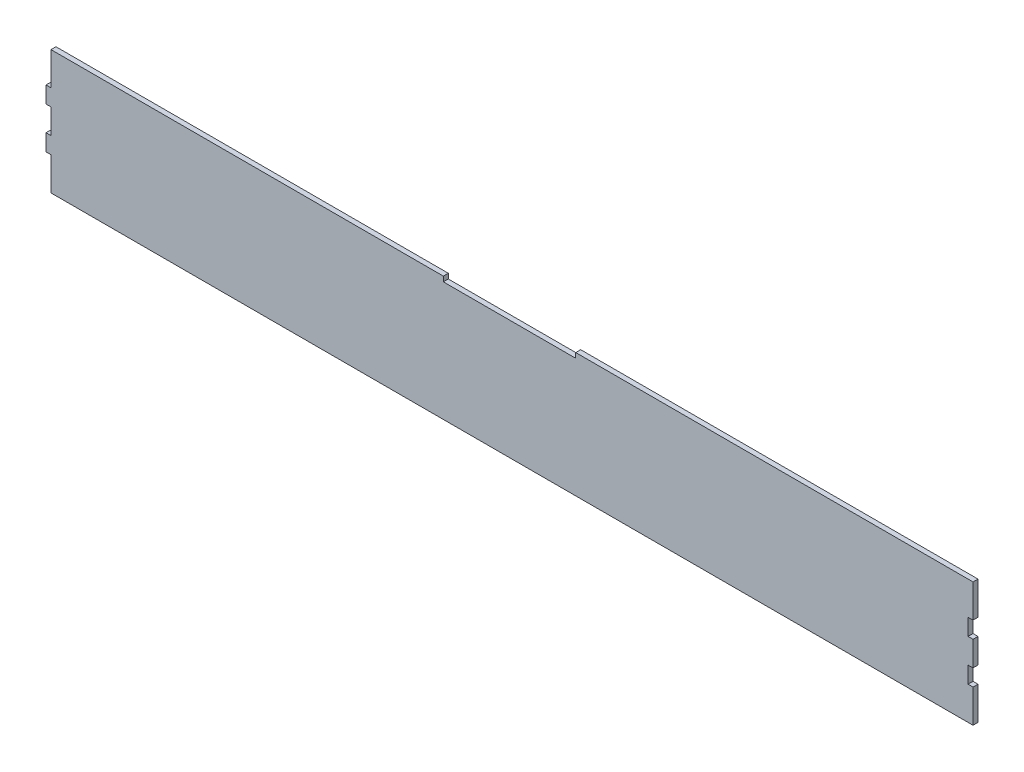
ISO-10303-21;
HEADER;
FILE_DESCRIPTION(('STEP AP214'),'2;1');
FILE_NAME('part.step','',(''),(''),'','','');
FILE_SCHEMA(('AUTOMOTIVE_DESIGN { 1 0 10303 214 1 1 1 1 }'));
ENDSEC;
DATA;
#1=APPLICATION_CONTEXT('core data for automotive mechanical design processes');
#2=APPLICATION_PROTOCOL_DEFINITION('international standard','automotive_design',2000,#1);
#3=PRODUCT_CONTEXT('',#1,'mechanical');
#4=PRODUCT('Part','Part','',(#3));
#5=PRODUCT_RELATED_PRODUCT_CATEGORY('part','',(#4));
#6=PRODUCT_DEFINITION_FORMATION('','',#4);
#7=PRODUCT_DEFINITION_CONTEXT('part definition',#1,'design');
#8=PRODUCT_DEFINITION('design','',#6,#7);
#9=PRODUCT_DEFINITION_SHAPE('','',#8);
#10=(LENGTH_UNIT() NAMED_UNIT(*) SI_UNIT(.MILLI.,.METRE.));
#11=(NAMED_UNIT(*) PLANE_ANGLE_UNIT() SI_UNIT($,.RADIAN.));
#12=(NAMED_UNIT(*) SI_UNIT($,.STERADIAN.) SOLID_ANGLE_UNIT());
#13=UNCERTAINTY_MEASURE_WITH_UNIT(LENGTH_MEASURE(1.E-05),#10,'distance_accuracy_value','');
#14=(GEOMETRIC_REPRESENTATION_CONTEXT(3) GLOBAL_UNCERTAINTY_ASSIGNED_CONTEXT((#13)) GLOBAL_UNIT_ASSIGNED_CONTEXT((#10,
#11,#12)) REPRESENTATION_CONTEXT('',''));
#15=CARTESIAN_POINT('',(0.,0.,0.));
#16=DIRECTION('',(0.,0.,1.));
#17=DIRECTION('',(1.,0.,0.));
#18=AXIS2_PLACEMENT_3D('',#15,#16,#17);
#19=CARTESIAN_POINT('',(-232.344937666755,214.488975695473,3.));
#20=DIRECTION('',(0.,1.,0.));
#21=DIRECTION('',(0.,0.,1.));
#22=AXIS2_PLACEMENT_3D('',#19,#20,#21);
#23=PLANE('',#22);
#24=DIRECTION('',(1.,0.,0.));
#25=VECTOR('',#24,1.);
#26=CARTESIAN_POINT('',(-232.344937666755,214.488975695473,0.));
#27=LINE('',#26,#25);
#28=CARTESIAN_POINT('',(87.6550623332451,214.488975695473,0.));
#29=VERTEX_POINT('',#28);
#30=CARTESIAN_POINT('',(327.655062333245,214.488975695473,0.));
#31=VERTEX_POINT('',#30);
#32=EDGE_CURVE('E407',#29,#31,#27,.T.);
#33=ORIENTED_EDGE('',*,*,#32,.F.);
#34=DIRECTION('',(0.,0.,1.));
#35=VECTOR('',#34,1.);
#36=CARTESIAN_POINT('',(87.6550623332451,214.488975695473,0.));
#37=LINE('',#36,#35);
#38=CARTESIAN_POINT('',(87.6550623332452,214.488975695473,3.));
#39=VERTEX_POINT('',#38);
#40=EDGE_CURVE('E202',#29,#39,#37,.T.);
#41=ORIENTED_EDGE('',*,*,#40,.T.);
#42=DIRECTION('',(1.,0.,0.));
#43=VECTOR('',#42,1.);
#44=CARTESIAN_POINT('',(-232.344937666755,214.488975695473,3.));
#45=LINE('',#44,#43);
#46=CARTESIAN_POINT('',(327.655062333245,214.488975695473,3.));
#47=VERTEX_POINT('',#46);
#48=EDGE_CURVE('E374',#39,#47,#45,.T.);
#49=ORIENTED_EDGE('',*,*,#48,.T.);
#50=DIRECTION('',(0.,0.,-1.));
#51=VECTOR('',#50,1.);
#52=CARTESIAN_POINT('',(327.655062333245,214.488975695473,3.));
#53=LINE('',#52,#51);
#54=EDGE_CURVE('E46',#47,#31,#53,.T.);
#55=ORIENTED_EDGE('',*,*,#54,.T.);
#56=EDGE_LOOP('',(#33,#41,#49,#55));
#57=FACE_BOUND('',#56,.T.);
#58=ADVANCED_FACE('F38',(#57),#23,.T.);
#59=CARTESIAN_POINT('',(0.,0.,3.));
#60=DIRECTION('',(0.,0.,-1.));
#61=DIRECTION('',(-1.,0.,0.));
#62=AXIS2_PLACEMENT_3D('',#59,#60,#61);
#63=PLANE('',#62);
#64=DIRECTION('',(1.,0.,0.));
#65=VECTOR('',#64,1.);
#66=CARTESIAN_POINT('',(7.65506233324513,211.488975695473,3.));
#67=LINE('',#66,#65);
#68=CARTESIAN_POINT('',(7.65506233324513,211.488975695473,3.));
#69=VERTEX_POINT('',#68);
#70=CARTESIAN_POINT('',(87.6550623332451,211.488975695473,3.));
#71=VERTEX_POINT('',#70);
#72=EDGE_CURVE('E214',#69,#71,#67,.T.);
#73=ORIENTED_EDGE('',*,*,#72,.F.);
#74=DIRECTION('',(0.,-1.,0.));
#75=VECTOR('',#74,1.);
#76=CARTESIAN_POINT('',(7.65506233324513,214.488975695473,3.));
#77=LINE('',#76,#75);
#78=CARTESIAN_POINT('',(7.65506233324513,214.488975695473,3.));
#79=VERTEX_POINT('',#78);
#80=EDGE_CURVE('E218',#79,#69,#77,.T.);
#81=ORIENTED_EDGE('',*,*,#80,.F.);
#82=CARTESIAN_POINT('',(-229.344937666755,214.488975695473,3.));
#83=VERTEX_POINT('',#82);
#84=EDGE_CURVE('E268',#83,#79,#45,.T.);
#85=ORIENTED_EDGE('',*,*,#84,.F.);
#86=DIRECTION('',(0.,-1.,0.));
#87=VECTOR('',#86,1.);
#88=CARTESIAN_POINT('',(-229.344937666755,214.488975695473,3.));
#89=LINE('',#88,#87);
#90=CARTESIAN_POINT('',(-229.344937666755,194.488975695473,3.));
#91=VERTEX_POINT('',#90);
#92=EDGE_CURVE('E245',#83,#91,#89,.T.);
#93=ORIENTED_EDGE('',*,*,#92,.T.);
#94=DIRECTION('',(1.,0.,0.));
#95=VECTOR('',#94,1.);
#96=CARTESIAN_POINT('',(-232.344937666755,194.488975695473,3.));
#97=LINE('',#96,#95);
#98=CARTESIAN_POINT('',(-232.344937666755,194.488975695473,3.));
#99=VERTEX_POINT('',#98);
#100=EDGE_CURVE('E248',#99,#91,#97,.T.);
#101=ORIENTED_EDGE('',*,*,#100,.F.);
#102=DIRECTION('',(0.,-1.,0.));
#103=VECTOR('',#102,1.);
#104=CARTESIAN_POINT('',(-232.344937666755,214.488975695473,3.));
#105=LINE('',#104,#103);
#106=CARTESIAN_POINT('',(-232.344937666755,184.488975695473,3.));
#107=VERTEX_POINT('',#106);
#108=EDGE_CURVE('E267',#99,#107,#105,.T.);
#109=ORIENTED_EDGE('',*,*,#108,.T.);
#110=DIRECTION('',(1.,0.,0.));
#111=VECTOR('',#110,1.);
#112=CARTESIAN_POINT('',(-232.344937666755,184.488975695473,3.));
#113=LINE('',#112,#111);
#114=CARTESIAN_POINT('',(-229.344937666755,184.488975695473,3.));
#115=VERTEX_POINT('',#114);
#116=EDGE_CURVE('E253',#107,#115,#113,.T.);
#117=ORIENTED_EDGE('',*,*,#116,.T.);
#118=DIRECTION('',(0.,1.,0.));
#119=VECTOR('',#118,1.);
#120=CARTESIAN_POINT('',(-229.344937666755,169.488975695473,3.));
#121=LINE('',#120,#119);
#122=CARTESIAN_POINT('',(-229.344937666755,169.488975695473,3.));
#123=VERTEX_POINT('',#122);
#124=EDGE_CURVE('E447',#123,#115,#121,.T.);
#125=ORIENTED_EDGE('',*,*,#124,.F.);
#126=DIRECTION('',(1.,0.,0.));
#127=VECTOR('',#126,1.);
#128=CARTESIAN_POINT('',(-232.344937666755,169.488975695473,3.));
#129=LINE('',#128,#127);
#130=CARTESIAN_POINT('',(-232.344937666755,169.488975695473,3.));
#131=VERTEX_POINT('',#130);
#132=EDGE_CURVE('E442',#131,#123,#129,.T.);
#133=ORIENTED_EDGE('',*,*,#132,.F.);
#134=CARTESIAN_POINT('',(-232.344937666755,159.488975695473,3.));
#135=VERTEX_POINT('',#134);
#136=EDGE_CURVE('E262',#131,#135,#105,.T.);
#137=ORIENTED_EDGE('',*,*,#136,.T.);
#138=DIRECTION('',(1.,0.,0.));
#139=VECTOR('',#138,1.);
#140=CARTESIAN_POINT('',(-232.344937666755,159.488975695473,3.));
#141=LINE('',#140,#139);
#142=CARTESIAN_POINT('',(-229.344937666755,159.488975695473,3.));
#143=VERTEX_POINT('',#142);
#144=EDGE_CURVE('E61',#135,#143,#141,.T.);
#145=ORIENTED_EDGE('',*,*,#144,.T.);
#146=DIRECTION('',(0.,1.,0.));
#147=VECTOR('',#146,1.);
#148=CARTESIAN_POINT('',(-229.344937666755,139.488975695473,3.));
#149=LINE('',#148,#147);
#150=CARTESIAN_POINT('',(-229.344937666755,139.488975695473,3.));
#151=VERTEX_POINT('',#150);
#152=EDGE_CURVE('E286',#151,#143,#149,.T.);
#153=ORIENTED_EDGE('',*,*,#152,.F.);
#154=DIRECTION('',(1.,0.,0.));
#155=VECTOR('',#154,1.);
#156=CARTESIAN_POINT('',(-232.344937666755,139.488975695473,3.));
#157=LINE('',#156,#155);
#158=CARTESIAN_POINT('',(327.655062333245,139.488975695473,3.));
#159=VERTEX_POINT('',#158);
#160=EDGE_CURVE('E365',#151,#159,#157,.T.);
#161=ORIENTED_EDGE('',*,*,#160,.T.);
#162=DIRECTION('',(0.,-1.,0.));
#163=VECTOR('',#162,1.);
#164=CARTESIAN_POINT('',(327.655062333245,214.488975695473,3.));
#165=LINE('',#164,#163);
#166=CARTESIAN_POINT('',(327.655062333245,159.488975695473,3.));
#167=VERTEX_POINT('',#166);
#168=EDGE_CURVE('E368',#167,#159,#165,.T.);
#169=ORIENTED_EDGE('',*,*,#168,.F.);
#170=DIRECTION('',(-1.,0.,0.));
#171=VECTOR('',#170,1.);
#172=CARTESIAN_POINT('',(327.655062333245,159.488975695473,3.));
#173=LINE('',#172,#171);
#174=CARTESIAN_POINT('',(324.655062333245,159.488975695473,3.));
#175=VERTEX_POINT('',#174);
#176=EDGE_CURVE('E343',#167,#175,#173,.T.);
#177=ORIENTED_EDGE('',*,*,#176,.T.);
#178=DIRECTION('',(0.,1.,0.));
#179=VECTOR('',#178,1.);
#180=CARTESIAN_POINT('',(324.655062333245,159.488975695473,3.));
#181=LINE('',#180,#179);
#182=CARTESIAN_POINT('',(324.655062333245,169.488975695473,3.));
#183=VERTEX_POINT('',#182);
#184=EDGE_CURVE('E348',#175,#183,#181,.T.);
#185=ORIENTED_EDGE('',*,*,#184,.T.);
#186=DIRECTION('',(-1.,0.,0.));
#187=VECTOR('',#186,1.);
#188=CARTESIAN_POINT('',(327.655062333245,169.488975695473,3.));
#189=LINE('',#188,#187);
#190=CARTESIAN_POINT('',(327.655062333245,169.488975695473,3.));
#191=VERTEX_POINT('',#190);
#192=EDGE_CURVE('E311',#191,#183,#189,.T.);
#193=ORIENTED_EDGE('',*,*,#192,.F.);
#194=CARTESIAN_POINT('',(327.655062333245,184.488975695473,3.));
#195=VERTEX_POINT('',#194);
#196=EDGE_CURVE('E375',#195,#191,#165,.T.);
#197=ORIENTED_EDGE('',*,*,#196,.F.);
#198=DIRECTION('',(-1.,0.,0.));
#199=VECTOR('',#198,1.);
#200=CARTESIAN_POINT('',(327.655062333245,184.488975695473,3.));
#201=LINE('',#200,#199);
#202=CARTESIAN_POINT('',(324.655062333245,184.488975695473,3.));
#203=VERTEX_POINT('',#202);
#204=EDGE_CURVE('E305',#195,#203,#201,.T.);
#205=ORIENTED_EDGE('',*,*,#204,.T.);
#206=DIRECTION('',(0.,-1.,0.));
#207=VECTOR('',#206,1.);
#208=CARTESIAN_POINT('',(324.655062333245,194.488975695473,3.));
#209=LINE('',#208,#207);
#210=CARTESIAN_POINT('',(324.655062333245,194.488975695473,3.));
#211=VERTEX_POINT('',#210);
#212=EDGE_CURVE('E310',#211,#203,#209,.T.);
#213=ORIENTED_EDGE('',*,*,#212,.F.);
#214=DIRECTION('',(-1.,0.,0.));
#215=VECTOR('',#214,1.);
#216=CARTESIAN_POINT('',(327.655062333245,194.488975695473,3.));
#217=LINE('',#216,#215);
#218=CARTESIAN_POINT('',(327.655062333245,194.488975695473,3.));
#219=VERTEX_POINT('',#218);
#220=EDGE_CURVE('E298',#219,#211,#217,.T.);
#221=ORIENTED_EDGE('',*,*,#220,.F.);
#222=EDGE_CURVE('E370',#47,#219,#165,.T.);
#223=ORIENTED_EDGE('',*,*,#222,.F.);
#224=ORIENTED_EDGE('',*,*,#48,.F.);
#225=DIRECTION('',(0.,-1.,0.));
#226=VECTOR('',#225,1.);
#227=CARTESIAN_POINT('',(87.6550623332451,214.488975695473,3.));
#228=LINE('',#227,#226);
#229=EDGE_CURVE('E53',#39,#71,#228,.T.);
#230=ORIENTED_EDGE('',*,*,#229,.T.);
#231=EDGE_LOOP('',(#73,#81,#85,#93,#101,#109,#117,#125,#133,#137,#145,#153,#161,#169,#177,#185,
#193,#197,#205,#213,#221,#223,#224,#230));
#232=FACE_BOUND('',#231,.T.);
#233=ADVANCED_FACE('F421',(#232),#63,.F.);
#234=CARTESIAN_POINT('',(0.,0.,0.));
#235=DIRECTION('',(0.,0.,-1.));
#236=DIRECTION('',(-1.,0.,0.));
#237=AXIS2_PLACEMENT_3D('',#234,#235,#236);
#238=PLANE('',#237);
#239=DIRECTION('',(0.,-1.,0.));
#240=VECTOR('',#239,1.);
#241=CARTESIAN_POINT('',(7.65506233324513,214.488975695473,0.));
#242=LINE('',#241,#240);
#243=CARTESIAN_POINT('',(7.65506233324513,214.488975695473,0.));
#244=VERTEX_POINT('',#243);
#245=CARTESIAN_POINT('',(7.65506233324513,211.488975695473,0.));
#246=VERTEX_POINT('',#245);
#247=EDGE_CURVE('E206',#244,#246,#242,.T.);
#248=ORIENTED_EDGE('',*,*,#247,.T.);
#249=DIRECTION('',(1.,0.,0.));
#250=VECTOR('',#249,1.);
#251=CARTESIAN_POINT('',(7.65506233324513,211.488975695473,0.));
#252=LINE('',#251,#250);
#253=CARTESIAN_POINT('',(87.6550623332451,211.488975695473,0.));
#254=VERTEX_POINT('',#253);
#255=EDGE_CURVE('E207',#246,#254,#252,.T.);
#256=ORIENTED_EDGE('',*,*,#255,.T.);
#257=DIRECTION('',(0.,-1.,0.));
#258=VECTOR('',#257,1.);
#259=CARTESIAN_POINT('',(87.6550623332451,214.488975695473,0.));
#260=LINE('',#259,#258);
#261=EDGE_CURVE('E197',#29,#254,#260,.T.);
#262=ORIENTED_EDGE('',*,*,#261,.F.);
#263=ORIENTED_EDGE('',*,*,#32,.T.);
#264=DIRECTION('',(0.,-1.,0.));
#265=VECTOR('',#264,1.);
#266=CARTESIAN_POINT('',(327.655062333245,214.488975695473,0.));
#267=LINE('',#266,#265);
#268=CARTESIAN_POINT('',(327.655062333245,194.488975695473,0.));
#269=VERTEX_POINT('',#268);
#270=EDGE_CURVE('E403',#31,#269,#267,.T.);
#271=ORIENTED_EDGE('',*,*,#270,.T.);
#272=DIRECTION('',(-1.,0.,0.));
#273=VECTOR('',#272,1.);
#274=CARTESIAN_POINT('',(327.655062333245,194.488975695473,0.));
#275=LINE('',#274,#273);
#276=CARTESIAN_POINT('',(324.655062333245,194.488975695473,0.));
#277=VERTEX_POINT('',#276);
#278=EDGE_CURVE('E301',#269,#277,#275,.T.);
#279=ORIENTED_EDGE('',*,*,#278,.T.);
#280=DIRECTION('',(0.,-1.,0.));
#281=VECTOR('',#280,1.);
#282=CARTESIAN_POINT('',(324.655062333245,194.488975695473,0.));
#283=LINE('',#282,#281);
#284=CARTESIAN_POINT('',(324.655062333245,184.488975695473,0.));
#285=VERTEX_POINT('',#284);
#286=EDGE_CURVE('E297',#277,#285,#283,.T.);
#287=ORIENTED_EDGE('',*,*,#286,.T.);
#288=DIRECTION('',(-1.,0.,0.));
#289=VECTOR('',#288,1.);
#290=CARTESIAN_POINT('',(327.655062333245,184.488975695473,0.));
#291=LINE('',#290,#289);
#292=CARTESIAN_POINT('',(327.655062333245,184.488975695473,0.));
#293=VERTEX_POINT('',#292);
#294=EDGE_CURVE('E295',#293,#285,#291,.T.);
#295=ORIENTED_EDGE('',*,*,#294,.F.);
#296=CARTESIAN_POINT('',(327.655062333245,169.488975695473,0.));
#297=VERTEX_POINT('',#296);
#298=EDGE_CURVE('E402',#293,#297,#267,.T.);
#299=ORIENTED_EDGE('',*,*,#298,.T.);
#300=DIRECTION('',(-1.,0.,0.));
#301=VECTOR('',#300,1.);
#302=CARTESIAN_POINT('',(327.655062333245,169.488975695473,0.));
#303=LINE('',#302,#301);
#304=CARTESIAN_POINT('',(324.655062333245,169.488975695473,0.));
#305=VERTEX_POINT('',#304);
#306=EDGE_CURVE('E349',#297,#305,#303,.T.);
#307=ORIENTED_EDGE('',*,*,#306,.T.);
#308=DIRECTION('',(0.,1.,0.));
#309=VECTOR('',#308,1.);
#310=CARTESIAN_POINT('',(324.655062333245,159.488975695473,0.));
#311=LINE('',#310,#309);
#312=CARTESIAN_POINT('',(324.655062333245,159.488975695473,0.));
#313=VERTEX_POINT('',#312);
#314=EDGE_CURVE('E361',#313,#305,#311,.T.);
#315=ORIENTED_EDGE('',*,*,#314,.F.);
#316=DIRECTION('',(-1.,0.,0.));
#317=VECTOR('',#316,1.);
#318=CARTESIAN_POINT('',(327.655062333245,159.488975695473,0.));
#319=LINE('',#318,#317);
#320=CARTESIAN_POINT('',(327.655062333245,159.488975695473,0.));
#321=VERTEX_POINT('',#320);
#322=EDGE_CURVE('E334',#321,#313,#319,.T.);
#323=ORIENTED_EDGE('',*,*,#322,.F.);
#324=CARTESIAN_POINT('',(327.655062333245,139.488975695473,0.));
#325=VERTEX_POINT('',#324);
#326=EDGE_CURVE('E399',#321,#325,#267,.T.);
#327=ORIENTED_EDGE('',*,*,#326,.T.);
#328=DIRECTION('',(1.,0.,0.));
#329=VECTOR('',#328,1.);
#330=CARTESIAN_POINT('',(-232.344937666755,139.488975695473,0.));
#331=LINE('',#330,#329);
#332=CARTESIAN_POINT('',(-229.344937666755,139.488975695473,0.));
#333=VERTEX_POINT('',#332);
#334=EDGE_CURVE('E271',#333,#325,#331,.T.);
#335=ORIENTED_EDGE('',*,*,#334,.F.);
#336=DIRECTION('',(0.,1.,0.));
#337=VECTOR('',#336,1.);
#338=CARTESIAN_POINT('',(-229.344937666755,139.488975695473,0.));
#339=LINE('',#338,#337);
#340=CARTESIAN_POINT('',(-229.344937666755,159.488975695473,0.));
#341=VERTEX_POINT('',#340);
#342=EDGE_CURVE('E289',#333,#341,#339,.T.);
#343=ORIENTED_EDGE('',*,*,#342,.T.);
#344=DIRECTION('',(1.,0.,0.));
#345=VECTOR('',#344,1.);
#346=CARTESIAN_POINT('',(-232.344937666755,159.488975695473,0.));
#347=LINE('',#346,#345);
#348=CARTESIAN_POINT('',(-232.344937666755,159.488975695473,0.));
#349=VERTEX_POINT('',#348);
#350=EDGE_CURVE('E292',#349,#341,#347,.T.);
#351=ORIENTED_EDGE('',*,*,#350,.F.);
#352=DIRECTION('',(0.,-1.,0.));
#353=VECTOR('',#352,1.);
#354=CARTESIAN_POINT('',(-232.344937666755,214.488975695473,0.));
#355=LINE('',#354,#353);
#356=CARTESIAN_POINT('',(-232.344937666755,169.488975695473,0.));
#357=VERTEX_POINT('',#356);
#358=EDGE_CURVE('E411',#357,#349,#355,.T.);
#359=ORIENTED_EDGE('',*,*,#358,.F.);
#360=DIRECTION('',(1.,0.,0.));
#361=VECTOR('',#360,1.);
#362=CARTESIAN_POINT('',(-232.344937666755,169.488975695473,0.));
#363=LINE('',#362,#361);
#364=CARTESIAN_POINT('',(-229.344937666755,169.488975695473,0.));
#365=VERTEX_POINT('',#364);
#366=EDGE_CURVE('E433',#357,#365,#363,.T.);
#367=ORIENTED_EDGE('',*,*,#366,.T.);
#368=DIRECTION('',(0.,1.,0.));
#369=VECTOR('',#368,1.);
#370=CARTESIAN_POINT('',(-229.344937666755,169.488975695473,0.));
#371=LINE('',#370,#369);
#372=CARTESIAN_POINT('',(-229.344937666755,184.488975695473,0.));
#373=VERTEX_POINT('',#372);
#374=EDGE_CURVE('E437',#365,#373,#371,.T.);
#375=ORIENTED_EDGE('',*,*,#374,.T.);
#376=DIRECTION('',(1.,0.,0.));
#377=VECTOR('',#376,1.);
#378=CARTESIAN_POINT('',(-232.344937666755,184.488975695473,0.));
#379=LINE('',#378,#377);
#380=CARTESIAN_POINT('',(-232.344937666755,184.488975695473,0.));
#381=VERTEX_POINT('',#380);
#382=EDGE_CURVE('E448',#381,#373,#379,.T.);
#383=ORIENTED_EDGE('',*,*,#382,.F.);
#384=CARTESIAN_POINT('',(-232.344937666755,194.488975695473,0.));
#385=VERTEX_POINT('',#384);
#386=EDGE_CURVE('E369',#385,#381,#355,.T.);
#387=ORIENTED_EDGE('',*,*,#386,.F.);
#388=DIRECTION('',(1.,0.,0.));
#389=VECTOR('',#388,1.);
#390=CARTESIAN_POINT('',(-232.344937666755,194.488975695473,0.));
#391=LINE('',#390,#389);
#392=CARTESIAN_POINT('',(-229.344937666755,194.488975695473,0.));
#393=VERTEX_POINT('',#392);
#394=EDGE_CURVE('E241',#385,#393,#391,.T.);
#395=ORIENTED_EDGE('',*,*,#394,.T.);
#396=DIRECTION('',(0.,-1.,0.));
#397=VECTOR('',#396,1.);
#398=CARTESIAN_POINT('',(-229.344937666755,214.488975695473,0.));
#399=LINE('',#398,#397);
#400=CARTESIAN_POINT('',(-229.344937666755,214.488975695473,0.));
#401=VERTEX_POINT('',#400);
#402=EDGE_CURVE('E244',#401,#393,#399,.T.);
#403=ORIENTED_EDGE('',*,*,#402,.F.);
#404=EDGE_CURVE('E409',#401,#244,#27,.T.);
#405=ORIENTED_EDGE('',*,*,#404,.T.);
#406=EDGE_LOOP('',(#248,#256,#262,#263,#271,#279,#287,#295,#299,#307,#315,#323,#327,#335,#343,
#351,#359,#367,#375,#383,#387,#395,#403,#405));
#407=FACE_BOUND('',#406,.T.);
#408=ADVANCED_FACE('F216',(#407),#238,.T.);
#409=DIRECTION('',(0.,0.,1.));
#410=VECTOR('',#409,1.);
#411=CARTESIAN_POINT('',(7.65506233324513,214.488975695473,0.));
#412=LINE('',#411,#410);
#413=EDGE_CURVE('E238',#244,#79,#412,.T.);
#414=ORIENTED_EDGE('',*,*,#413,.F.);
#415=ORIENTED_EDGE('',*,*,#404,.F.);
#416=DIRECTION('',(0.,0.,1.));
#417=VECTOR('',#416,1.);
#418=CARTESIAN_POINT('',(-229.344937666755,214.488975695473,0.));
#419=LINE('',#418,#417);
#420=EDGE_CURVE('E513',#401,#83,#419,.T.);
#421=ORIENTED_EDGE('',*,*,#420,.T.);
#422=ORIENTED_EDGE('',*,*,#84,.T.);
#423=EDGE_LOOP('',(#414,#415,#421,#422));
#424=FACE_BOUND('',#423,.T.);
#425=ADVANCED_FACE('F489',(#424),#23,.T.);
#426=CARTESIAN_POINT('',(-232.344937666755,214.488975695473,3.));
#427=DIRECTION('',(1.,0.,0.));
#428=DIRECTION('',(0.,1.,0.));
#429=AXIS2_PLACEMENT_3D('',#426,#427,#428);
#430=PLANE('',#429);
#431=ORIENTED_EDGE('',*,*,#108,.F.);
#432=DIRECTION('',(0.,0.,1.));
#433=VECTOR('',#432,1.);
#434=CARTESIAN_POINT('',(-232.344937666755,194.488975695473,0.));
#435=LINE('',#434,#433);
#436=EDGE_CURVE('E342',#385,#99,#435,.T.);
#437=ORIENTED_EDGE('',*,*,#436,.F.);
#438=ORIENTED_EDGE('',*,*,#386,.T.);
#439=DIRECTION('',(0.,0.,1.));
#440=VECTOR('',#439,1.);
#441=CARTESIAN_POINT('',(-232.344937666755,184.488975695473,0.));
#442=LINE('',#441,#440);
#443=EDGE_CURVE('E430',#381,#107,#442,.T.);
#444=ORIENTED_EDGE('',*,*,#443,.T.);
#445=EDGE_LOOP('',(#431,#437,#438,#444));
#446=FACE_BOUND('',#445,.T.);
#447=ADVANCED_FACE('F427',(#446),#430,.F.);
#448=ORIENTED_EDGE('',*,*,#136,.F.);
#449=DIRECTION('',(0.,0.,1.));
#450=VECTOR('',#449,1.);
#451=CARTESIAN_POINT('',(-232.344937666755,169.488975695473,0.));
#452=LINE('',#451,#450);
#453=EDGE_CURVE('E434',#357,#131,#452,.T.);
#454=ORIENTED_EDGE('',*,*,#453,.F.);
#455=ORIENTED_EDGE('',*,*,#358,.T.);
#456=DIRECTION('',(0.,0.,1.));
#457=VECTOR('',#456,1.);
#458=CARTESIAN_POINT('',(-232.344937666755,159.488975695473,0.));
#459=LINE('',#458,#457);
#460=EDGE_CURVE('E293',#349,#135,#459,.T.);
#461=ORIENTED_EDGE('',*,*,#460,.T.);
#462=EDGE_LOOP('',(#448,#454,#455,#461));
#463=FACE_BOUND('',#462,.T.);
#464=ADVANCED_FACE('F460',(#463),#430,.F.);
#465=CARTESIAN_POINT('',(327.655062333245,214.488975695473,3.));
#466=DIRECTION('',(1.,0.,0.));
#467=DIRECTION('',(0.,1.,0.));
#468=AXIS2_PLACEMENT_3D('',#465,#466,#467);
#469=PLANE('',#468);
#470=ORIENTED_EDGE('',*,*,#298,.F.);
#471=DIRECTION('',(0.,0.,1.));
#472=VECTOR('',#471,1.);
#473=CARTESIAN_POINT('',(327.655062333245,184.488975695473,0.));
#474=LINE('',#473,#472);
#475=EDGE_CURVE('E304',#293,#195,#474,.T.);
#476=ORIENTED_EDGE('',*,*,#475,.T.);
#477=ORIENTED_EDGE('',*,*,#196,.T.);
#478=DIRECTION('',(0.,0.,1.));
#479=VECTOR('',#478,1.);
#480=CARTESIAN_POINT('',(327.655062333245,169.488975695473,0.));
#481=LINE('',#480,#479);
#482=EDGE_CURVE('E340',#297,#191,#481,.T.);
#483=ORIENTED_EDGE('',*,*,#482,.F.);
#484=EDGE_LOOP('',(#470,#476,#477,#483));
#485=FACE_BOUND('',#484,.T.);
#486=ADVANCED_FACE('F564',(#485),#469,.T.);
#487=ORIENTED_EDGE('',*,*,#326,.F.);
#488=DIRECTION('',(0.,0.,1.));
#489=VECTOR('',#488,1.);
#490=CARTESIAN_POINT('',(327.655062333245,159.488975695473,0.));
#491=LINE('',#490,#489);
#492=EDGE_CURVE('E337',#321,#167,#491,.T.);
#493=ORIENTED_EDGE('',*,*,#492,.T.);
#494=ORIENTED_EDGE('',*,*,#168,.T.);
#495=DIRECTION('',(0.,0.,-1.));
#496=VECTOR('',#495,1.);
#497=CARTESIAN_POINT('',(327.655062333245,139.488975695473,3.));
#498=LINE('',#497,#496);
#499=EDGE_CURVE('E12',#159,#325,#498,.T.);
#500=ORIENTED_EDGE('',*,*,#499,.T.);
#501=EDGE_LOOP('',(#487,#493,#494,#500));
#502=FACE_BOUND('',#501,.T.);
#503=ADVANCED_FACE('F391',(#502),#469,.T.);
#504=CARTESIAN_POINT('',(-232.344937666755,139.488975695473,3.));
#505=DIRECTION('',(0.,1.,0.));
#506=DIRECTION('',(0.,0.,1.));
#507=AXIS2_PLACEMENT_3D('',#504,#505,#506);
#508=PLANE('',#507);
#509=ORIENTED_EDGE('',*,*,#160,.F.);
#510=DIRECTION('',(0.,0.,1.));
#511=VECTOR('',#510,1.);
#512=CARTESIAN_POINT('',(-229.344937666755,139.488975695473,0.));
#513=LINE('',#512,#511);
#514=EDGE_CURVE('E398',#333,#151,#513,.T.);
#515=ORIENTED_EDGE('',*,*,#514,.F.);
#516=ORIENTED_EDGE('',*,*,#334,.T.);
#517=ORIENTED_EDGE('',*,*,#499,.F.);
#518=EDGE_LOOP('',(#509,#515,#516,#517));
#519=FACE_BOUND('',#518,.T.);
#520=ADVANCED_FACE('F40',(#519),#508,.F.);
#521=DIRECTION('',(0.,0.,1.));
#522=VECTOR('',#521,1.);
#523=CARTESIAN_POINT('',(327.655062333245,194.488975695473,0.));
#524=LINE('',#523,#522);
#525=EDGE_CURVE('E326',#269,#219,#524,.T.);
#526=ORIENTED_EDGE('',*,*,#525,.F.);
#527=ORIENTED_EDGE('',*,*,#270,.F.);
#528=ORIENTED_EDGE('',*,*,#54,.F.);
#529=ORIENTED_EDGE('',*,*,#222,.T.);
#530=EDGE_LOOP('',(#526,#527,#528,#529));
#531=FACE_BOUND('',#530,.T.);
#532=ADVANCED_FACE('F543',(#531),#469,.T.);
#533=CARTESIAN_POINT('',(327.655062333245,169.488975695473,0.));
#534=DIRECTION('',(0.,1.,0.));
#535=DIRECTION('',(0.,0.,1.));
#536=AXIS2_PLACEMENT_3D('',#533,#534,#535);
#537=PLANE('',#536);
#538=ORIENTED_EDGE('',*,*,#192,.T.);
#539=DIRECTION('',(0.,0.,1.));
#540=VECTOR('',#539,1.);
#541=CARTESIAN_POINT('',(324.655062333245,169.488975695473,0.));
#542=LINE('',#541,#540);
#543=EDGE_CURVE('E332',#305,#183,#542,.T.);
#544=ORIENTED_EDGE('',*,*,#543,.F.);
#545=ORIENTED_EDGE('',*,*,#306,.F.);
#546=ORIENTED_EDGE('',*,*,#482,.T.);
#547=EDGE_LOOP('',(#538,#544,#545,#546));
#548=FACE_BOUND('',#547,.T.);
#549=ADVANCED_FACE('F560',(#548),#537,.F.);
#550=CARTESIAN_POINT('',(327.655062333245,159.488975695473,0.));
#551=DIRECTION('',(0.,1.,0.));
#552=DIRECTION('',(0.,0.,1.));
#553=AXIS2_PLACEMENT_3D('',#550,#551,#552);
#554=PLANE('',#553);
#555=ORIENTED_EDGE('',*,*,#176,.F.);
#556=ORIENTED_EDGE('',*,*,#492,.F.);
#557=ORIENTED_EDGE('',*,*,#322,.T.);
#558=DIRECTION('',(0.,0.,1.));
#559=VECTOR('',#558,1.);
#560=CARTESIAN_POINT('',(324.655062333245,159.488975695473,0.));
#561=LINE('',#560,#559);
#562=EDGE_CURVE('E335',#313,#175,#561,.T.);
#563=ORIENTED_EDGE('',*,*,#562,.T.);
#564=EDGE_LOOP('',(#555,#556,#557,#563));
#565=FACE_BOUND('',#564,.T.);
#566=ADVANCED_FACE('F579',(#565),#554,.T.);
#567=CARTESIAN_POINT('',(324.655062333245,159.488975695473,0.));
#568=DIRECTION('',(1.,0.,0.));
#569=DIRECTION('',(0.,1.,0.));
#570=AXIS2_PLACEMENT_3D('',#567,#568,#569);
#571=PLANE('',#570);
#572=ORIENTED_EDGE('',*,*,#184,.F.);
#573=ORIENTED_EDGE('',*,*,#562,.F.);
#574=ORIENTED_EDGE('',*,*,#314,.T.);
#575=ORIENTED_EDGE('',*,*,#543,.T.);
#576=EDGE_LOOP('',(#572,#573,#574,#575));
#577=FACE_BOUND('',#576,.T.);
#578=ADVANCED_FACE('F557',(#577),#571,.T.);
#579=CARTESIAN_POINT('',(327.655062333245,184.488975695473,0.));
#580=DIRECTION('',(0.,1.,0.));
#581=DIRECTION('',(0.,0.,1.));
#582=AXIS2_PLACEMENT_3D('',#579,#580,#581);
#583=PLANE('',#582);
#584=ORIENTED_EDGE('',*,*,#204,.F.);
#585=ORIENTED_EDGE('',*,*,#475,.F.);
#586=ORIENTED_EDGE('',*,*,#294,.T.);
#587=DIRECTION('',(0.,0.,1.));
#588=VECTOR('',#587,1.);
#589=CARTESIAN_POINT('',(324.655062333245,184.488975695473,0.));
#590=LINE('',#589,#588);
#591=EDGE_CURVE('E330',#285,#203,#590,.T.);
#592=ORIENTED_EDGE('',*,*,#591,.T.);
#593=EDGE_LOOP('',(#584,#585,#586,#592));
#594=FACE_BOUND('',#593,.T.);
#595=ADVANCED_FACE('F567',(#594),#583,.T.);
#596=CARTESIAN_POINT('',(324.655062333245,194.488975695473,0.));
#597=DIRECTION('',(-1.,0.,0.));
#598=DIRECTION('',(0.,0.,1.));
#599=AXIS2_PLACEMENT_3D('',#596,#597,#598);
#600=PLANE('',#599);
#601=ORIENTED_EDGE('',*,*,#212,.T.);
#602=ORIENTED_EDGE('',*,*,#591,.F.);
#603=ORIENTED_EDGE('',*,*,#286,.F.);
#604=DIRECTION('',(0.,0.,1.));
#605=VECTOR('',#604,1.);
#606=CARTESIAN_POINT('',(324.655062333245,194.488975695473,0.));
#607=LINE('',#606,#605);
#608=EDGE_CURVE('E328',#277,#211,#607,.T.);
#609=ORIENTED_EDGE('',*,*,#608,.T.);
#610=EDGE_LOOP('',(#601,#602,#603,#609));
#611=FACE_BOUND('',#610,.T.);
#612=ADVANCED_FACE('F568',(#611),#600,.F.);
#613=CARTESIAN_POINT('',(327.655062333245,194.488975695473,0.));
#614=DIRECTION('',(0.,1.,0.));
#615=DIRECTION('',(0.,0.,1.));
#616=AXIS2_PLACEMENT_3D('',#613,#614,#615);
#617=PLANE('',#616);
#618=ORIENTED_EDGE('',*,*,#220,.T.);
#619=ORIENTED_EDGE('',*,*,#608,.F.);
#620=ORIENTED_EDGE('',*,*,#278,.F.);
#621=ORIENTED_EDGE('',*,*,#525,.T.);
#622=EDGE_LOOP('',(#618,#619,#620,#621));
#623=FACE_BOUND('',#622,.T.);
#624=ADVANCED_FACE('F484',(#623),#617,.F.);
#625=CARTESIAN_POINT('',(-232.344937666755,159.488975695473,0.));
#626=DIRECTION('',(0.,-1.,0.));
#627=DIRECTION('',(0.,0.,-1.));
#628=AXIS2_PLACEMENT_3D('',#625,#626,#627);
#629=PLANE('',#628);
#630=ORIENTED_EDGE('',*,*,#144,.F.);
#631=ORIENTED_EDGE('',*,*,#460,.F.);
#632=ORIENTED_EDGE('',*,*,#350,.T.);
#633=DIRECTION('',(0.,0.,1.));
#634=VECTOR('',#633,1.);
#635=CARTESIAN_POINT('',(-229.344937666755,159.488975695473,0.));
#636=LINE('',#635,#634);
#637=EDGE_CURVE('E237',#341,#143,#636,.T.);
#638=ORIENTED_EDGE('',*,*,#637,.T.);
#639=EDGE_LOOP('',(#630,#631,#632,#638));
#640=FACE_BOUND('',#639,.T.);
#641=ADVANCED_FACE('F470',(#640),#629,.T.);
#642=CARTESIAN_POINT('',(-229.344937666755,139.488975695473,0.));
#643=DIRECTION('',(1.,0.,0.));
#644=DIRECTION('',(0.,0.,-1.));
#645=AXIS2_PLACEMENT_3D('',#642,#643,#644);
#646=PLANE('',#645);
#647=ORIENTED_EDGE('',*,*,#152,.T.);
#648=ORIENTED_EDGE('',*,*,#637,.F.);
#649=ORIENTED_EDGE('',*,*,#342,.F.);
#650=ORIENTED_EDGE('',*,*,#514,.T.);
#651=EDGE_LOOP('',(#647,#648,#649,#650));
#652=FACE_BOUND('',#651,.T.);
#653=ADVANCED_FACE('F473',(#652),#646,.F.);
#654=CARTESIAN_POINT('',(-232.344937666755,184.488975695473,0.));
#655=DIRECTION('',(0.,-1.,0.));
#656=DIRECTION('',(0.,0.,-1.));
#657=AXIS2_PLACEMENT_3D('',#654,#655,#656);
#658=PLANE('',#657);
#659=ORIENTED_EDGE('',*,*,#116,.F.);
#660=ORIENTED_EDGE('',*,*,#443,.F.);
#661=ORIENTED_EDGE('',*,*,#382,.T.);
#662=DIRECTION('',(0.,0.,1.));
#663=VECTOR('',#662,1.);
#664=CARTESIAN_POINT('',(-229.344937666755,184.488975695473,0.));
#665=LINE('',#664,#663);
#666=EDGE_CURVE('E285',#373,#115,#665,.T.);
#667=ORIENTED_EDGE('',*,*,#666,.T.);
#668=EDGE_LOOP('',(#659,#660,#661,#667));
#669=FACE_BOUND('',#668,.T.);
#670=ADVANCED_FACE('F476',(#669),#658,.T.);
#671=CARTESIAN_POINT('',(-229.344937666755,169.488975695473,0.));
#672=DIRECTION('',(1.,0.,0.));
#673=DIRECTION('',(0.,0.,-1.));
#674=AXIS2_PLACEMENT_3D('',#671,#672,#673);
#675=PLANE('',#674);
#676=ORIENTED_EDGE('',*,*,#124,.T.);
#677=ORIENTED_EDGE('',*,*,#666,.F.);
#678=ORIENTED_EDGE('',*,*,#374,.F.);
#679=DIRECTION('',(0.,0.,1.));
#680=VECTOR('',#679,1.);
#681=CARTESIAN_POINT('',(-229.344937666755,169.488975695473,0.));
#682=LINE('',#681,#680);
#683=EDGE_CURVE('E439',#365,#123,#682,.T.);
#684=ORIENTED_EDGE('',*,*,#683,.T.);
#685=EDGE_LOOP('',(#676,#677,#678,#684));
#686=FACE_BOUND('',#685,.T.);
#687=ADVANCED_FACE('F482',(#686),#675,.F.);
#688=CARTESIAN_POINT('',(-232.344937666755,169.488975695473,0.));
#689=DIRECTION('',(0.,-1.,0.));
#690=DIRECTION('',(0.,0.,-1.));
#691=AXIS2_PLACEMENT_3D('',#688,#689,#690);
#692=PLANE('',#691);
#693=ORIENTED_EDGE('',*,*,#132,.T.);
#694=ORIENTED_EDGE('',*,*,#683,.F.);
#695=ORIENTED_EDGE('',*,*,#366,.F.);
#696=ORIENTED_EDGE('',*,*,#453,.T.);
#697=EDGE_LOOP('',(#693,#694,#695,#696));
#698=FACE_BOUND('',#697,.T.);
#699=ADVANCED_FACE('F467',(#698),#692,.F.);
#700=CARTESIAN_POINT('',(-232.344937666755,194.488975695473,0.));
#701=DIRECTION('',(0.,-1.,0.));
#702=DIRECTION('',(0.,0.,-1.));
#703=AXIS2_PLACEMENT_3D('',#700,#701,#702);
#704=PLANE('',#703);
#705=ORIENTED_EDGE('',*,*,#100,.T.);
#706=DIRECTION('',(0.,0.,1.));
#707=VECTOR('',#706,1.);
#708=CARTESIAN_POINT('',(-229.344937666755,194.488975695473,0.));
#709=LINE('',#708,#707);
#710=EDGE_CURVE('E247',#393,#91,#709,.T.);
#711=ORIENTED_EDGE('',*,*,#710,.F.);
#712=ORIENTED_EDGE('',*,*,#394,.F.);
#713=ORIENTED_EDGE('',*,*,#436,.T.);
#714=EDGE_LOOP('',(#705,#711,#712,#713));
#715=FACE_BOUND('',#714,.T.);
#716=ADVANCED_FACE('F515',(#715),#704,.F.);
#717=CARTESIAN_POINT('',(-229.344937666755,214.488975695473,0.));
#718=DIRECTION('',(-1.,0.,0.));
#719=DIRECTION('',(0.,0.,1.));
#720=AXIS2_PLACEMENT_3D('',#717,#718,#719);
#721=PLANE('',#720);
#722=ORIENTED_EDGE('',*,*,#92,.F.);
#723=ORIENTED_EDGE('',*,*,#420,.F.);
#724=ORIENTED_EDGE('',*,*,#402,.T.);
#725=ORIENTED_EDGE('',*,*,#710,.T.);
#726=EDGE_LOOP('',(#722,#723,#724,#725));
#727=FACE_BOUND('',#726,.T.);
#728=ADVANCED_FACE('F512',(#727),#721,.T.);
#729=CARTESIAN_POINT('',(7.65506233324513,211.488975695473,0.));
#730=DIRECTION('',(0.,-1.,0.));
#731=DIRECTION('',(1.,0.,0.));
#732=AXIS2_PLACEMENT_3D('',#729,#730,#731);
#733=PLANE('',#732);
#734=ORIENTED_EDGE('',*,*,#72,.T.);
#735=DIRECTION('',(0.,0.,1.));
#736=VECTOR('',#735,1.);
#737=CARTESIAN_POINT('',(87.6550623332451,211.488975695473,0.));
#738=LINE('',#737,#736);
#739=EDGE_CURVE('E200',#254,#71,#738,.T.);
#740=ORIENTED_EDGE('',*,*,#739,.F.);
#741=ORIENTED_EDGE('',*,*,#255,.F.);
#742=DIRECTION('',(0.,0.,1.));
#743=VECTOR('',#742,1.);
#744=CARTESIAN_POINT('',(7.65506233324513,211.488975695473,0.));
#745=LINE('',#744,#743);
#746=EDGE_CURVE('E235',#246,#69,#745,.T.);
#747=ORIENTED_EDGE('',*,*,#746,.T.);
#748=EDGE_LOOP('',(#734,#740,#741,#747));
#749=FACE_BOUND('',#748,.T.);
#750=ADVANCED_FACE('F211',(#749),#733,.F.);
#751=CARTESIAN_POINT('',(7.65506233324513,214.488975695473,0.));
#752=DIRECTION('',(-1.,0.,0.));
#753=DIRECTION('',(0.,-1.,0.));
#754=AXIS2_PLACEMENT_3D('',#751,#752,#753);
#755=PLANE('',#754);
#756=ORIENTED_EDGE('',*,*,#80,.T.);
#757=ORIENTED_EDGE('',*,*,#746,.F.);
#758=ORIENTED_EDGE('',*,*,#247,.F.);
#759=ORIENTED_EDGE('',*,*,#413,.T.);
#760=EDGE_LOOP('',(#756,#757,#758,#759));
#761=FACE_BOUND('',#760,.T.);
#762=ADVANCED_FACE('F534',(#761),#755,.F.);
#763=CARTESIAN_POINT('',(87.6550623332451,214.488975695473,0.));
#764=DIRECTION('',(-1.,0.,0.));
#765=DIRECTION('',(0.,0.,1.));
#766=AXIS2_PLACEMENT_3D('',#763,#764,#765);
#767=PLANE('',#766);
#768=ORIENTED_EDGE('',*,*,#229,.F.);
#769=ORIENTED_EDGE('',*,*,#40,.F.);
#770=ORIENTED_EDGE('',*,*,#261,.T.);
#771=ORIENTED_EDGE('',*,*,#739,.T.);
#772=EDGE_LOOP('',(#768,#769,#770,#771));
#773=FACE_BOUND('',#772,.T.);
#774=ADVANCED_FACE('F199',(#773),#767,.T.);
#775=CLOSED_SHELL('',(#58,#233,#408,#425,#447,#464,#486,#503,#520,#532,#549,#566,#578,#595,#612,
#624,#641,#653,#670,#687,#699,#716,#728,#750,#762,#774));
#776=MANIFOLD_SOLID_BREP('B2',#775);
#777=ADVANCED_BREP_SHAPE_REPRESENTATION('',(#18,#776),#14);
#778=SHAPE_DEFINITION_REPRESENTATION(#9,#777);
ENDSEC;
END-ISO-10303-21;
